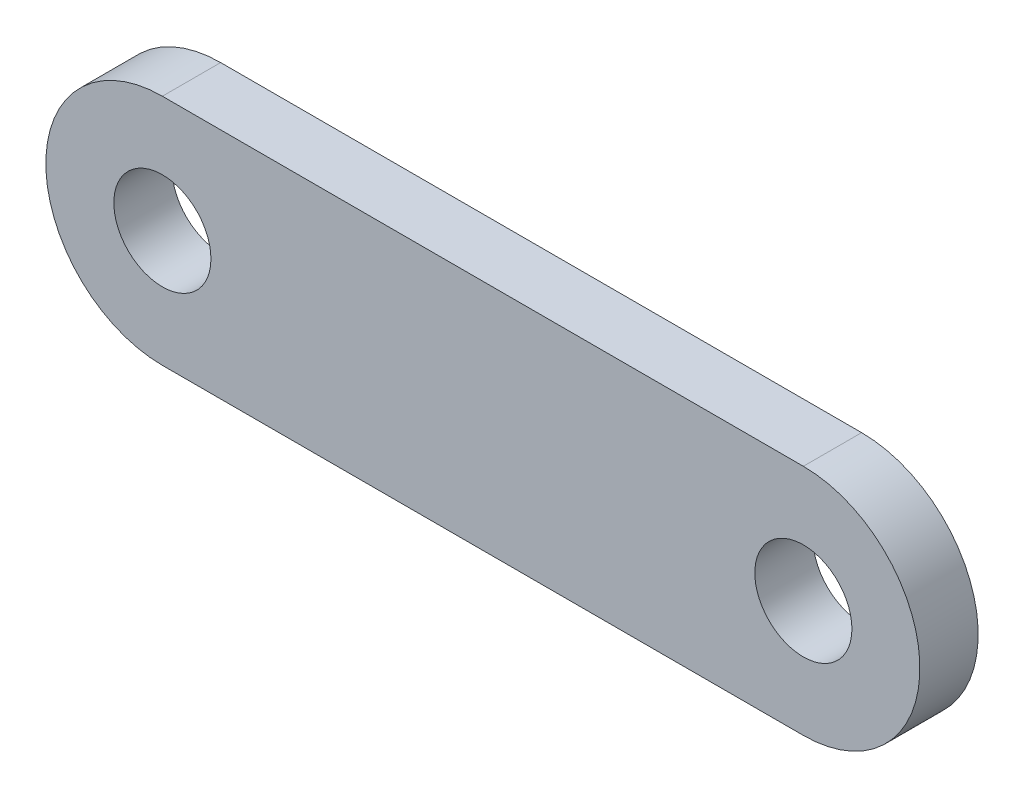
ISO-10303-21;
HEADER;
FILE_DESCRIPTION(('STEP AP214'),'2;1');
FILE_NAME('part.step','',(''),(''),'','','');
FILE_SCHEMA(('AUTOMOTIVE_DESIGN { 1 0 10303 214 1 1 1 1 }'));
ENDSEC;
DATA;
#1=APPLICATION_CONTEXT('core data for automotive mechanical design processes');
#2=APPLICATION_PROTOCOL_DEFINITION('international standard','automotive_design',2000,#1);
#3=PRODUCT_CONTEXT('',#1,'mechanical');
#4=PRODUCT('Part','Part','',(#3));
#5=PRODUCT_RELATED_PRODUCT_CATEGORY('part','',(#4));
#6=PRODUCT_DEFINITION_FORMATION('','',#4);
#7=PRODUCT_DEFINITION_CONTEXT('part definition',#1,'design');
#8=PRODUCT_DEFINITION('design','',#6,#7);
#9=PRODUCT_DEFINITION_SHAPE('','',#8);
#10=(LENGTH_UNIT() NAMED_UNIT(*) SI_UNIT(.MILLI.,.METRE.));
#11=(NAMED_UNIT(*) PLANE_ANGLE_UNIT() SI_UNIT($,.RADIAN.));
#12=(NAMED_UNIT(*) SI_UNIT($,.STERADIAN.) SOLID_ANGLE_UNIT());
#13=UNCERTAINTY_MEASURE_WITH_UNIT(LENGTH_MEASURE(1.E-05),#10,'distance_accuracy_value','');
#14=(GEOMETRIC_REPRESENTATION_CONTEXT(3) GLOBAL_UNCERTAINTY_ASSIGNED_CONTEXT((#13)) GLOBAL_UNIT_ASSIGNED_CONTEXT((#10,
#11,#12)) REPRESENTATION_CONTEXT('',''));
#15=CARTESIAN_POINT('',(0.,0.,0.));
#16=DIRECTION('',(0.,0.,1.));
#17=DIRECTION('',(1.,0.,0.));
#18=AXIS2_PLACEMENT_3D('',#15,#16,#17);
#19=CARTESIAN_POINT('',(0.,-6.,3.));
#20=DIRECTION('',(0.,1.,0.));
#21=DIRECTION('',(-1.,0.,0.));
#22=AXIS2_PLACEMENT_3D('',#19,#20,#21);
#23=PLANE('',#22);
#24=DIRECTION('',(1.,0.,0.));
#25=VECTOR('',#24,1.);
#26=CARTESIAN_POINT('',(0.,-6.,0.));
#27=LINE('',#26,#25);
#28=CARTESIAN_POINT('',(0.,-6.,0.));
#29=VERTEX_POINT('',#28);
#30=CARTESIAN_POINT('',(33.,-6.,0.));
#31=VERTEX_POINT('',#30);
#32=EDGE_CURVE('E107',#29,#31,#27,.T.);
#33=ORIENTED_EDGE('',*,*,#32,.T.);
#34=DIRECTION('',(0.,0.,-1.));
#35=VECTOR('',#34,1.);
#36=CARTESIAN_POINT('',(33.,-6.,3.));
#37=LINE('',#36,#35);
#38=CARTESIAN_POINT('',(33.,-6.,3.));
#39=VERTEX_POINT('',#38);
#40=EDGE_CURVE('E11',#39,#31,#37,.T.);
#41=ORIENTED_EDGE('',*,*,#40,.F.);
#42=DIRECTION('',(1.,0.,0.));
#43=VECTOR('',#42,1.);
#44=CARTESIAN_POINT('',(0.,-6.,3.));
#45=LINE('',#44,#43);
#46=CARTESIAN_POINT('',(0.,-6.,3.));
#47=VERTEX_POINT('',#46);
#48=EDGE_CURVE('E86',#47,#39,#45,.T.);
#49=ORIENTED_EDGE('',*,*,#48,.F.);
#50=DIRECTION('',(0.,0.,-1.));
#51=VECTOR('',#50,1.);
#52=CARTESIAN_POINT('',(0.,-6.,3.));
#53=LINE('',#52,#51);
#54=EDGE_CURVE('E103',#47,#29,#53,.T.);
#55=ORIENTED_EDGE('',*,*,#54,.T.);
#56=EDGE_LOOP('',(#33,#41,#49,#55));
#57=FACE_BOUND('',#56,.T.);
#58=ADVANCED_FACE('F37',(#57),#23,.F.);
#59=CARTESIAN_POINT('',(33.,0.,3.));
#60=DIRECTION('',(0.,0.,-1.));
#61=DIRECTION('',(-1.,0.,0.));
#62=AXIS2_PLACEMENT_3D('',#59,#60,#61);
#63=CYLINDRICAL_SURFACE('',#62,6.);
#64=CARTESIAN_POINT('',(33.,0.,0.));
#65=DIRECTION('',(0.,0.,1.));
#66=DIRECTION('',(1.,0.,0.));
#67=AXIS2_PLACEMENT_3D('',#64,#65,#66);
#68=CIRCLE('',#67,6.);
#69=CARTESIAN_POINT('',(33.,6.,0.));
#70=VERTEX_POINT('',#69);
#71=EDGE_CURVE('E91',#31,#70,#68,.T.);
#72=ORIENTED_EDGE('',*,*,#71,.T.);
#73=DIRECTION('',(0.,0.,-1.));
#74=VECTOR('',#73,1.);
#75=CARTESIAN_POINT('',(33.,6.,3.));
#76=LINE('',#75,#74);
#77=CARTESIAN_POINT('',(33.,6.,3.));
#78=VERTEX_POINT('',#77);
#79=EDGE_CURVE('E46',#78,#70,#76,.T.);
#80=ORIENTED_EDGE('',*,*,#79,.F.);
#81=CARTESIAN_POINT('',(33.,0.,3.));
#82=DIRECTION('',(0.,0.,1.));
#83=DIRECTION('',(1.,0.,0.));
#84=AXIS2_PLACEMENT_3D('',#81,#82,#83);
#85=CIRCLE('',#84,6.);
#86=EDGE_CURVE('E80',#39,#78,#85,.T.);
#87=ORIENTED_EDGE('',*,*,#86,.F.);
#88=ORIENTED_EDGE('',*,*,#40,.T.);
#89=EDGE_LOOP('',(#72,#80,#87,#88));
#90=FACE_BOUND('',#89,.T.);
#91=ADVANCED_FACE('F90',(#90),#63,.T.);
#92=CARTESIAN_POINT('',(0.,6.,3.));
#93=DIRECTION('',(0.,1.,0.));
#94=DIRECTION('',(-1.,0.,0.));
#95=AXIS2_PLACEMENT_3D('',#92,#93,#94);
#96=PLANE('',#95);
#97=DIRECTION('',(1.,0.,0.));
#98=VECTOR('',#97,1.);
#99=CARTESIAN_POINT('',(0.,6.,0.));
#100=LINE('',#99,#98);
#101=CARTESIAN_POINT('',(0.,6.,0.));
#102=VERTEX_POINT('',#101);
#103=EDGE_CURVE('E111',#102,#70,#100,.T.);
#104=ORIENTED_EDGE('',*,*,#103,.F.);
#105=DIRECTION('',(0.,0.,-1.));
#106=VECTOR('',#105,1.);
#107=CARTESIAN_POINT('',(0.,6.,3.));
#108=LINE('',#107,#106);
#109=CARTESIAN_POINT('',(0.,6.,3.));
#110=VERTEX_POINT('',#109);
#111=EDGE_CURVE('E70',#110,#102,#108,.T.);
#112=ORIENTED_EDGE('',*,*,#111,.F.);
#113=DIRECTION('',(1.,0.,0.));
#114=VECTOR('',#113,1.);
#115=CARTESIAN_POINT('',(0.,6.,3.));
#116=LINE('',#115,#114);
#117=EDGE_CURVE('E84',#110,#78,#116,.T.);
#118=ORIENTED_EDGE('',*,*,#117,.T.);
#119=ORIENTED_EDGE('',*,*,#79,.T.);
#120=EDGE_LOOP('',(#104,#112,#118,#119));
#121=FACE_BOUND('',#120,.T.);
#122=ADVANCED_FACE('F95',(#121),#96,.T.);
#123=CARTESIAN_POINT('',(0.,0.,3.));
#124=DIRECTION('',(0.,0.,-1.));
#125=DIRECTION('',(-1.,0.,0.));
#126=AXIS2_PLACEMENT_3D('',#123,#124,#125);
#127=CYLINDRICAL_SURFACE('',#126,6.);
#128=CARTESIAN_POINT('',(0.,0.,0.));
#129=DIRECTION('',(0.,0.,1.));
#130=DIRECTION('',(1.,0.,0.));
#131=AXIS2_PLACEMENT_3D('',#128,#129,#130);
#132=CIRCLE('',#131,6.);
#133=EDGE_CURVE('E73',#102,#29,#132,.T.);
#134=ORIENTED_EDGE('',*,*,#133,.T.);
#135=ORIENTED_EDGE('',*,*,#54,.F.);
#136=CARTESIAN_POINT('',(0.,0.,3.));
#137=DIRECTION('',(0.,0.,1.));
#138=DIRECTION('',(1.,0.,0.));
#139=AXIS2_PLACEMENT_3D('',#136,#137,#138);
#140=CIRCLE('',#139,6.);
#141=EDGE_CURVE('E54',#110,#47,#140,.T.);
#142=ORIENTED_EDGE('',*,*,#141,.F.);
#143=ORIENTED_EDGE('',*,*,#111,.T.);
#144=EDGE_LOOP('',(#134,#135,#142,#143));
#145=FACE_BOUND('',#144,.T.);
#146=ADVANCED_FACE('F139',(#145),#127,.T.);
#147=CARTESIAN_POINT('',(0.,0.,3.));
#148=DIRECTION('',(0.,0.,-1.));
#149=DIRECTION('',(-1.,0.,0.));
#150=AXIS2_PLACEMENT_3D('',#147,#148,#149);
#151=CYLINDRICAL_SURFACE('',#150,2.5);
#152=CARTESIAN_POINT('',(0.,0.,3.));
#153=DIRECTION('',(0.,0.,1.));
#154=DIRECTION('',(1.,0.,0.));
#155=AXIS2_PLACEMENT_3D('',#152,#153,#154);
#156=CIRCLE('',#155,2.5);
#157=CARTESIAN_POINT('',(2.5,0.,3.));
#158=VERTEX_POINT('',#157);
#159=EDGE_CURVE('E117',#158,#158,#156,.T.);
#160=ORIENTED_EDGE('',*,*,#159,.T.);
#161=EDGE_LOOP('',(#160));
#162=FACE_BOUND('',#161,.T.);
#163=CARTESIAN_POINT('',(0.,0.,0.));
#164=DIRECTION('',(0.,0.,1.));
#165=DIRECTION('',(1.,0.,0.));
#166=AXIS2_PLACEMENT_3D('',#163,#164,#165);
#167=CIRCLE('',#166,2.5);
#168=CARTESIAN_POINT('',(2.5,0.,0.));
#169=VERTEX_POINT('',#168);
#170=EDGE_CURVE('E104',#169,#169,#167,.T.);
#171=ORIENTED_EDGE('',*,*,#170,.F.);
#172=EDGE_LOOP('',(#171));
#173=FACE_BOUND('',#172,.T.);
#174=ADVANCED_FACE('F39',(#162,#173),#151,.F.);
#175=CARTESIAN_POINT('',(33.,0.,3.));
#176=DIRECTION('',(0.,0.,-1.));
#177=DIRECTION('',(-1.,0.,0.));
#178=AXIS2_PLACEMENT_3D('',#175,#176,#177);
#179=CYLINDRICAL_SURFACE('',#178,2.49999999999999);
#180=CARTESIAN_POINT('',(33.,0.,3.));
#181=DIRECTION('',(0.,0.,1.));
#182=DIRECTION('',(1.,0.,0.));
#183=AXIS2_PLACEMENT_3D('',#180,#181,#182);
#184=CIRCLE('',#183,2.49999999999999);
#185=CARTESIAN_POINT('',(35.5,0.,3.));
#186=VERTEX_POINT('',#185);
#187=EDGE_CURVE('E97',#186,#186,#184,.T.);
#188=ORIENTED_EDGE('',*,*,#187,.T.);
#189=EDGE_LOOP('',(#188));
#190=FACE_BOUND('',#189,.T.);
#191=CARTESIAN_POINT('',(33.,0.,0.));
#192=DIRECTION('',(0.,0.,1.));
#193=DIRECTION('',(1.,0.,0.));
#194=AXIS2_PLACEMENT_3D('',#191,#192,#193);
#195=CIRCLE('',#194,2.49999999999999);
#196=CARTESIAN_POINT('',(35.5,0.,0.));
#197=VERTEX_POINT('',#196);
#198=EDGE_CURVE('E114',#197,#197,#195,.T.);
#199=ORIENTED_EDGE('',*,*,#198,.F.);
#200=EDGE_LOOP('',(#199));
#201=FACE_BOUND('',#200,.T.);
#202=ADVANCED_FACE('F129',(#190,#201),#179,.F.);
#203=CARTESIAN_POINT('',(0.,0.,3.));
#204=DIRECTION('',(0.,0.,1.));
#205=DIRECTION('',(1.,0.,0.));
#206=AXIS2_PLACEMENT_3D('',#203,#204,#205);
#207=PLANE('',#206);
#208=ORIENTED_EDGE('',*,*,#159,.F.);
#209=EDGE_LOOP('',(#208));
#210=FACE_BOUND('',#209,.T.);
#211=ORIENTED_EDGE('',*,*,#48,.T.);
#212=ORIENTED_EDGE('',*,*,#86,.T.);
#213=ORIENTED_EDGE('',*,*,#117,.F.);
#214=ORIENTED_EDGE('',*,*,#141,.T.);
#215=EDGE_LOOP('',(#211,#212,#213,#214));
#216=FACE_BOUND('',#215,.T.);
#217=ORIENTED_EDGE('',*,*,#187,.F.);
#218=EDGE_LOOP('',(#217));
#219=FACE_BOUND('',#218,.T.);
#220=ADVANCED_FACE('F81',(#210,#216,#219),#207,.T.);
#221=CARTESIAN_POINT('',(0.,0.,0.));
#222=DIRECTION('',(0.,0.,1.));
#223=DIRECTION('',(1.,0.,0.));
#224=AXIS2_PLACEMENT_3D('',#221,#222,#223);
#225=PLANE('',#224);
#226=ORIENTED_EDGE('',*,*,#170,.T.);
#227=EDGE_LOOP('',(#226));
#228=FACE_BOUND('',#227,.T.);
#229=ORIENTED_EDGE('',*,*,#32,.F.);
#230=ORIENTED_EDGE('',*,*,#133,.F.);
#231=ORIENTED_EDGE('',*,*,#103,.T.);
#232=ORIENTED_EDGE('',*,*,#71,.F.);
#233=EDGE_LOOP('',(#229,#230,#231,#232));
#234=FACE_BOUND('',#233,.T.);
#235=ORIENTED_EDGE('',*,*,#198,.T.);
#236=EDGE_LOOP('',(#235));
#237=FACE_BOUND('',#236,.T.);
#238=ADVANCED_FACE('F122',(#228,#234,#237),#225,.F.);
#239=CLOSED_SHELL('',(#58,#91,#122,#146,#174,#202,#220,#238));
#240=MANIFOLD_SOLID_BREP('B2',#239);
#241=ADVANCED_BREP_SHAPE_REPRESENTATION('',(#18,#240),#14);
#242=SHAPE_DEFINITION_REPRESENTATION(#9,#241);
ENDSEC;
END-ISO-10303-21;
